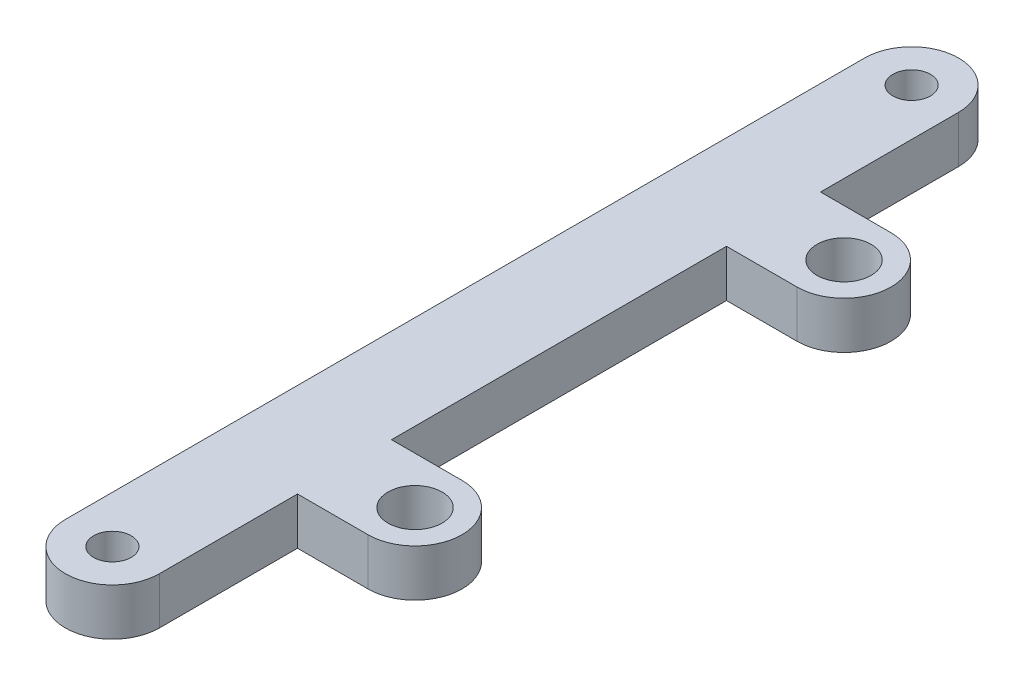
ISO-10303-21;
HEADER;
FILE_DESCRIPTION(('STEP AP214'),'2;1');
FILE_NAME('part.step','',(''),(''),'','','');
FILE_SCHEMA(('AUTOMOTIVE_DESIGN { 1 0 10303 214 1 1 1 1 }'));
ENDSEC;
DATA;
#1=APPLICATION_CONTEXT('core data for automotive mechanical design processes');
#2=APPLICATION_PROTOCOL_DEFINITION('international standard','automotive_design',2000,#1);
#3=PRODUCT_CONTEXT('',#1,'mechanical');
#4=PRODUCT('Part','Part','',(#3));
#5=PRODUCT_RELATED_PRODUCT_CATEGORY('part','',(#4));
#6=PRODUCT_DEFINITION_FORMATION('','',#4);
#7=PRODUCT_DEFINITION_CONTEXT('part definition',#1,'design');
#8=PRODUCT_DEFINITION('design','',#6,#7);
#9=PRODUCT_DEFINITION_SHAPE('','',#8);
#10=(LENGTH_UNIT() NAMED_UNIT(*) SI_UNIT(.MILLI.,.METRE.));
#11=(NAMED_UNIT(*) PLANE_ANGLE_UNIT() SI_UNIT($,.RADIAN.));
#12=(NAMED_UNIT(*) SI_UNIT($,.STERADIAN.) SOLID_ANGLE_UNIT());
#13=UNCERTAINTY_MEASURE_WITH_UNIT(LENGTH_MEASURE(1.E-05),#10,'distance_accuracy_value','');
#14=(GEOMETRIC_REPRESENTATION_CONTEXT(3) GLOBAL_UNCERTAINTY_ASSIGNED_CONTEXT((#13)) GLOBAL_UNIT_ASSIGNED_CONTEXT((#10,
#11,#12)) REPRESENTATION_CONTEXT('',''));
#15=CARTESIAN_POINT('',(0.,0.,0.));
#16=DIRECTION('',(0.,0.,1.));
#17=DIRECTION('',(1.,0.,0.));
#18=AXIS2_PLACEMENT_3D('',#15,#16,#17);
#19=CARTESIAN_POINT('',(0.,4.,-68.));
#20=DIRECTION('',(0.,1.,0.));
#21=DIRECTION('',(0.,0.,1.));
#22=AXIS2_PLACEMENT_3D('',#19,#20,#21);
#23=PLANE('',#22);
#24=CARTESIAN_POINT('',(10.,4.,-52.25));
#25=DIRECTION('',(0.,1.,0.));
#26=DIRECTION('',(0.,0.,1.));
#27=AXIS2_PLACEMENT_3D('',#24,#25,#26);
#28=CIRCLE('',#27,2.3);
#29=CARTESIAN_POINT('',(10.,4.,-49.95));
#30=VERTEX_POINT('',#29);
#31=EDGE_CURVE('E336',#30,#30,#28,.T.);
#32=ORIENTED_EDGE('',*,*,#31,.F.);
#33=EDGE_LOOP('',(#32));
#34=FACE_BOUND('',#33,.T.);
#35=CARTESIAN_POINT('',(0.,4.,-68.));
#36=DIRECTION('',(0.,1.,0.));
#37=DIRECTION('',(0.,0.,1.));
#38=AXIS2_PLACEMENT_3D('',#35,#36,#37);
#39=CIRCLE('',#38,1.6);
#40=CARTESIAN_POINT('',(0.,4.,-66.4));
#41=VERTEX_POINT('',#40);
#42=EDGE_CURVE('E174',#41,#41,#39,.T.);
#43=ORIENTED_EDGE('',*,*,#42,.F.);
#44=EDGE_LOOP('',(#43));
#45=FACE_BOUND('',#44,.T.);
#46=CARTESIAN_POINT('',(0.,4.,-68.));
#47=DIRECTION('',(0.,1.,0.));
#48=DIRECTION('',(0.,0.,1.));
#49=AXIS2_PLACEMENT_3D('',#46,#47,#48);
#50=CIRCLE('',#49,4.);
#51=CARTESIAN_POINT('',(4.,4.,-68.));
#52=VERTEX_POINT('',#51);
#53=CARTESIAN_POINT('',(-4.,4.,-68.));
#54=VERTEX_POINT('',#53);
#55=EDGE_CURVE('E204',#52,#54,#50,.T.);
#56=ORIENTED_EDGE('',*,*,#55,.T.);
#57=DIRECTION('',(0.,0.,1.));
#58=VECTOR('',#57,1.);
#59=CARTESIAN_POINT('',(-4.,4.,-68.));
#60=LINE('',#59,#58);
#61=CARTESIAN_POINT('',(-4.,4.,0.));
#62=VERTEX_POINT('',#61);
#63=EDGE_CURVE('E116',#54,#62,#60,.T.);
#64=ORIENTED_EDGE('',*,*,#63,.T.);
#65=CARTESIAN_POINT('',(0.,4.,0.));
#66=DIRECTION('',(0.,1.,0.));
#67=DIRECTION('',(0.,0.,1.));
#68=AXIS2_PLACEMENT_3D('',#65,#66,#67);
#69=CIRCLE('',#68,4.);
#70=CARTESIAN_POINT('',(4.,4.,0.));
#71=VERTEX_POINT('',#70);
#72=EDGE_CURVE('E241',#62,#71,#69,.T.);
#73=ORIENTED_EDGE('',*,*,#72,.T.);
#74=DIRECTION('',(0.,0.,-1.));
#75=VECTOR('',#74,1.);
#76=CARTESIAN_POINT('',(4.,4.,-11.75));
#77=LINE('',#76,#75);
#78=CARTESIAN_POINT('',(4.,4.,-11.75));
#79=VERTEX_POINT('',#78);
#80=EDGE_CURVE('E261',#71,#79,#77,.T.);
#81=ORIENTED_EDGE('',*,*,#80,.T.);
#82=DIRECTION('',(1.,0.,0.));
#83=VECTOR('',#82,1.);
#84=CARTESIAN_POINT('',(10.,4.,-11.75));
#85=LINE('',#84,#83);
#86=CARTESIAN_POINT('',(10.,4.,-11.75));
#87=VERTEX_POINT('',#86);
#88=EDGE_CURVE('E257',#79,#87,#85,.T.);
#89=ORIENTED_EDGE('',*,*,#88,.T.);
#90=CARTESIAN_POINT('',(10.,4.,-15.75));
#91=DIRECTION('',(0.,1.,0.));
#92=DIRECTION('',(0.,0.,-1.));
#93=AXIS2_PLACEMENT_3D('',#90,#91,#92);
#94=CIRCLE('',#93,4.);
#95=CARTESIAN_POINT('',(10.,4.,-19.75));
#96=VERTEX_POINT('',#95);
#97=EDGE_CURVE('E260',#87,#96,#94,.T.);
#98=ORIENTED_EDGE('',*,*,#97,.T.);
#99=DIRECTION('',(-1.,0.,0.));
#100=VECTOR('',#99,1.);
#101=CARTESIAN_POINT('',(10.,4.,-19.75));
#102=LINE('',#101,#100);
#103=CARTESIAN_POINT('',(4.,4.,-19.75));
#104=VERTEX_POINT('',#103);
#105=EDGE_CURVE('E265',#96,#104,#102,.T.);
#106=ORIENTED_EDGE('',*,*,#105,.T.);
#107=DIRECTION('',(0.,0.,-1.));
#108=VECTOR('',#107,1.);
#109=CARTESIAN_POINT('',(4.,4.,-48.25));
#110=LINE('',#109,#108);
#111=CARTESIAN_POINT('',(4.,4.,-48.25));
#112=VERTEX_POINT('',#111);
#113=EDGE_CURVE('E272',#104,#112,#110,.T.);
#114=ORIENTED_EDGE('',*,*,#113,.T.);
#115=DIRECTION('',(1.,0.,0.));
#116=VECTOR('',#115,1.);
#117=CARTESIAN_POINT('',(10.,4.,-48.25));
#118=LINE('',#117,#116);
#119=CARTESIAN_POINT('',(10.,4.,-48.25));
#120=VERTEX_POINT('',#119);
#121=EDGE_CURVE('E147',#112,#120,#118,.T.);
#122=ORIENTED_EDGE('',*,*,#121,.T.);
#123=CARTESIAN_POINT('',(10.,4.,-52.25));
#124=DIRECTION('',(0.,1.,0.));
#125=DIRECTION('',(0.,0.,1.));
#126=AXIS2_PLACEMENT_3D('',#123,#124,#125);
#127=CIRCLE('',#126,4.);
#128=CARTESIAN_POINT('',(10.,4.,-56.25));
#129=VERTEX_POINT('',#128);
#130=EDGE_CURVE('E141',#120,#129,#127,.T.);
#131=ORIENTED_EDGE('',*,*,#130,.T.);
#132=DIRECTION('',(-1.,0.,0.));
#133=VECTOR('',#132,1.);
#134=CARTESIAN_POINT('',(10.,4.,-56.25));
#135=LINE('',#134,#133);
#136=CARTESIAN_POINT('',(4.,4.,-56.25));
#137=VERTEX_POINT('',#136);
#138=EDGE_CURVE('E145',#129,#137,#135,.T.);
#139=ORIENTED_EDGE('',*,*,#138,.T.);
#140=DIRECTION('',(0.,0.,-1.));
#141=VECTOR('',#140,1.);
#142=CARTESIAN_POINT('',(4.,4.,-68.));
#143=LINE('',#142,#141);
#144=EDGE_CURVE('E61',#137,#52,#143,.T.);
#145=ORIENTED_EDGE('',*,*,#144,.T.);
#146=EDGE_LOOP('',(#56,#64,#73,#81,#89,#98,#106,#114,#122,#131,#139,#145));
#147=FACE_BOUND('',#146,.T.);
#148=CARTESIAN_POINT('',(0.,4.,0.));
#149=DIRECTION('',(0.,1.,0.));
#150=DIRECTION('',(0.,0.,1.));
#151=AXIS2_PLACEMENT_3D('',#148,#149,#150);
#152=CIRCLE('',#151,1.6);
#153=CARTESIAN_POINT('',(0.,4.,1.6));
#154=VERTEX_POINT('',#153);
#155=EDGE_CURVE('E344',#154,#154,#152,.T.);
#156=ORIENTED_EDGE('',*,*,#155,.F.);
#157=EDGE_LOOP('',(#156));
#158=FACE_BOUND('',#157,.T.);
#159=CARTESIAN_POINT('',(10.,4.,-15.75));
#160=DIRECTION('',(0.,1.,0.));
#161=DIRECTION('',(0.,0.,-1.));
#162=AXIS2_PLACEMENT_3D('',#159,#160,#161);
#163=CIRCLE('',#162,2.3);
#164=CARTESIAN_POINT('',(10.,4.,-18.05));
#165=VERTEX_POINT('',#164);
#166=EDGE_CURVE('E325',#165,#165,#163,.T.);
#167=ORIENTED_EDGE('',*,*,#166,.F.);
#168=EDGE_LOOP('',(#167));
#169=FACE_BOUND('',#168,.T.);
#170=ADVANCED_FACE('F43',(#34,#45,#147,#158,#169),#23,.T.);
#171=CARTESIAN_POINT('',(0.,0.,-68.));
#172=DIRECTION('',(0.,1.,0.));
#173=DIRECTION('',(0.,0.,1.));
#174=AXIS2_PLACEMENT_3D('',#171,#172,#173);
#175=PLANE('',#174);
#176=CARTESIAN_POINT('',(0.,0.,-68.));
#177=DIRECTION('',(0.,1.,0.));
#178=DIRECTION('',(0.,0.,1.));
#179=AXIS2_PLACEMENT_3D('',#176,#177,#178);
#180=CIRCLE('',#179,4.);
#181=CARTESIAN_POINT('',(4.,0.,-68.));
#182=VERTEX_POINT('',#181);
#183=CARTESIAN_POINT('',(-4.,0.,-68.));
#184=VERTEX_POINT('',#183);
#185=EDGE_CURVE('E169',#182,#184,#180,.T.);
#186=ORIENTED_EDGE('',*,*,#185,.F.);
#187=DIRECTION('',(0.,0.,-1.));
#188=VECTOR('',#187,1.);
#189=CARTESIAN_POINT('',(4.,0.,-68.));
#190=LINE('',#189,#188);
#191=CARTESIAN_POINT('',(4.,0.,-56.25));
#192=VERTEX_POINT('',#191);
#193=EDGE_CURVE('E108',#192,#182,#190,.T.);
#194=ORIENTED_EDGE('',*,*,#193,.F.);
#195=DIRECTION('',(-1.,0.,0.));
#196=VECTOR('',#195,1.);
#197=CARTESIAN_POINT('',(10.,0.,-56.25));
#198=LINE('',#197,#196);
#199=CARTESIAN_POINT('',(10.,0.,-56.25));
#200=VERTEX_POINT('',#199);
#201=EDGE_CURVE('E102',#200,#192,#198,.T.);
#202=ORIENTED_EDGE('',*,*,#201,.F.);
#203=CARTESIAN_POINT('',(10.,0.,-52.25));
#204=DIRECTION('',(0.,1.,0.));
#205=DIRECTION('',(0.,0.,1.));
#206=AXIS2_PLACEMENT_3D('',#203,#204,#205);
#207=CIRCLE('',#206,4.);
#208=CARTESIAN_POINT('',(10.,0.,-48.25));
#209=VERTEX_POINT('',#208);
#210=EDGE_CURVE('E156',#209,#200,#207,.T.);
#211=ORIENTED_EDGE('',*,*,#210,.F.);
#212=DIRECTION('',(1.,0.,0.));
#213=VECTOR('',#212,1.);
#214=CARTESIAN_POINT('',(10.,0.,-48.25));
#215=LINE('',#214,#213);
#216=CARTESIAN_POINT('',(4.,0.,-48.25));
#217=VERTEX_POINT('',#216);
#218=EDGE_CURVE('E195',#217,#209,#215,.T.);
#219=ORIENTED_EDGE('',*,*,#218,.F.);
#220=DIRECTION('',(0.,0.,-1.));
#221=VECTOR('',#220,1.);
#222=CARTESIAN_POINT('',(4.,0.,-48.25));
#223=LINE('',#222,#221);
#224=CARTESIAN_POINT('',(4.,0.,-19.75));
#225=VERTEX_POINT('',#224);
#226=EDGE_CURVE('E192',#225,#217,#223,.T.);
#227=ORIENTED_EDGE('',*,*,#226,.F.);
#228=DIRECTION('',(-1.,0.,0.));
#229=VECTOR('',#228,1.);
#230=CARTESIAN_POINT('',(10.,0.,-19.75));
#231=LINE('',#230,#229);
#232=CARTESIAN_POINT('',(10.,0.,-19.75));
#233=VERTEX_POINT('',#232);
#234=EDGE_CURVE('E189',#233,#225,#231,.T.);
#235=ORIENTED_EDGE('',*,*,#234,.F.);
#236=CARTESIAN_POINT('',(10.,0.,-15.75));
#237=DIRECTION('',(0.,1.,0.));
#238=DIRECTION('',(0.,0.,-1.));
#239=AXIS2_PLACEMENT_3D('',#236,#237,#238);
#240=CIRCLE('',#239,4.);
#241=CARTESIAN_POINT('',(10.,0.,-11.75));
#242=VERTEX_POINT('',#241);
#243=EDGE_CURVE('E186',#242,#233,#240,.T.);
#244=ORIENTED_EDGE('',*,*,#243,.F.);
#245=DIRECTION('',(1.,0.,0.));
#246=VECTOR('',#245,1.);
#247=CARTESIAN_POINT('',(10.,0.,-11.75));
#248=LINE('',#247,#246);
#249=CARTESIAN_POINT('',(4.,0.,-11.75));
#250=VERTEX_POINT('',#249);
#251=EDGE_CURVE('E183',#250,#242,#248,.T.);
#252=ORIENTED_EDGE('',*,*,#251,.F.);
#253=DIRECTION('',(0.,0.,-1.));
#254=VECTOR('',#253,1.);
#255=CARTESIAN_POINT('',(4.,0.,-11.75));
#256=LINE('',#255,#254);
#257=CARTESIAN_POINT('',(4.,0.,0.));
#258=VERTEX_POINT('',#257);
#259=EDGE_CURVE('E180',#258,#250,#256,.T.);
#260=ORIENTED_EDGE('',*,*,#259,.F.);
#261=CARTESIAN_POINT('',(0.,0.,0.));
#262=DIRECTION('',(0.,1.,0.));
#263=DIRECTION('',(0.,0.,1.));
#264=AXIS2_PLACEMENT_3D('',#261,#262,#263);
#265=CIRCLE('',#264,4.);
#266=CARTESIAN_POINT('',(-4.,0.,0.));
#267=VERTEX_POINT('',#266);
#268=EDGE_CURVE('E177',#267,#258,#265,.T.);
#269=ORIENTED_EDGE('',*,*,#268,.F.);
#270=DIRECTION('',(0.,0.,1.));
#271=VECTOR('',#270,1.);
#272=CARTESIAN_POINT('',(-4.,0.,-68.));
#273=LINE('',#272,#271);
#274=EDGE_CURVE('E173',#184,#267,#273,.T.);
#275=ORIENTED_EDGE('',*,*,#274,.F.);
#276=EDGE_LOOP('',(#186,#194,#202,#211,#219,#227,#235,#244,#252,#260,#269,#275));
#277=FACE_BOUND('',#276,.T.);
#278=CARTESIAN_POINT('',(0.,0.,-68.));
#279=DIRECTION('',(0.,1.,0.));
#280=DIRECTION('',(0.,0.,1.));
#281=AXIS2_PLACEMENT_3D('',#278,#279,#280);
#282=CIRCLE('',#281,1.6);
#283=CARTESIAN_POINT('',(0.,0.,-66.4));
#284=VERTEX_POINT('',#283);
#285=EDGE_CURVE('E348',#284,#284,#282,.T.);
#286=ORIENTED_EDGE('',*,*,#285,.T.);
#287=EDGE_LOOP('',(#286));
#288=FACE_BOUND('',#287,.T.);
#289=CARTESIAN_POINT('',(0.,0.,0.));
#290=DIRECTION('',(0.,1.,0.));
#291=DIRECTION('',(0.,0.,1.));
#292=AXIS2_PLACEMENT_3D('',#289,#290,#291);
#293=CIRCLE('',#292,1.6);
#294=CARTESIAN_POINT('',(0.,0.,1.6));
#295=VERTEX_POINT('',#294);
#296=EDGE_CURVE('E340',#295,#295,#293,.T.);
#297=ORIENTED_EDGE('',*,*,#296,.T.);
#298=EDGE_LOOP('',(#297));
#299=FACE_BOUND('',#298,.T.);
#300=CARTESIAN_POINT('',(10.,0.,-52.25));
#301=DIRECTION('',(0.,1.,0.));
#302=DIRECTION('',(0.,0.,1.));
#303=AXIS2_PLACEMENT_3D('',#300,#301,#302);
#304=CIRCLE('',#303,2.3);
#305=CARTESIAN_POINT('',(10.,0.,-49.95));
#306=VERTEX_POINT('',#305);
#307=EDGE_CURVE('E333',#306,#306,#304,.T.);
#308=ORIENTED_EDGE('',*,*,#307,.T.);
#309=EDGE_LOOP('',(#308));
#310=FACE_BOUND('',#309,.T.);
#311=CARTESIAN_POINT('',(10.,0.,-15.75));
#312=DIRECTION('',(0.,1.,0.));
#313=DIRECTION('',(0.,0.,-1.));
#314=AXIS2_PLACEMENT_3D('',#311,#312,#313);
#315=CIRCLE('',#314,2.3);
#316=CARTESIAN_POINT('',(10.,0.,-18.05));
#317=VERTEX_POINT('',#316);
#318=EDGE_CURVE('E328',#317,#317,#315,.T.);
#319=ORIENTED_EDGE('',*,*,#318,.T.);
#320=EDGE_LOOP('',(#319));
#321=FACE_BOUND('',#320,.T.);
#322=ADVANCED_FACE('F245',(#277,#288,#299,#310,#321),#175,.F.);
#323=CARTESIAN_POINT('',(0.,4.,-68.));
#324=DIRECTION('',(0.,-1.,0.));
#325=DIRECTION('',(0.,0.,-1.));
#326=AXIS2_PLACEMENT_3D('',#323,#324,#325);
#327=CYLINDRICAL_SURFACE('',#326,4.);
#328=ORIENTED_EDGE('',*,*,#185,.T.);
#329=DIRECTION('',(0.,-1.,0.));
#330=VECTOR('',#329,1.);
#331=CARTESIAN_POINT('',(-4.,4.,-68.));
#332=LINE('',#331,#330);
#333=EDGE_CURVE('E11',#54,#184,#332,.T.);
#334=ORIENTED_EDGE('',*,*,#333,.F.);
#335=ORIENTED_EDGE('',*,*,#55,.F.);
#336=DIRECTION('',(0.,-1.,0.));
#337=VECTOR('',#336,1.);
#338=CARTESIAN_POINT('',(4.,4.,-68.));
#339=LINE('',#338,#337);
#340=EDGE_CURVE('E165',#52,#182,#339,.T.);
#341=ORIENTED_EDGE('',*,*,#340,.T.);
#342=EDGE_LOOP('',(#328,#334,#335,#341));
#343=FACE_BOUND('',#342,.T.);
#344=ADVANCED_FACE('F45',(#343),#327,.T.);
#345=CARTESIAN_POINT('',(-4.,4.,-68.));
#346=DIRECTION('',(1.,0.,0.));
#347=DIRECTION('',(0.,0.,-1.));
#348=AXIS2_PLACEMENT_3D('',#345,#346,#347);
#349=PLANE('',#348);
#350=ORIENTED_EDGE('',*,*,#274,.T.);
#351=DIRECTION('',(0.,-1.,0.));
#352=VECTOR('',#351,1.);
#353=CARTESIAN_POINT('',(-4.,4.,0.));
#354=LINE('',#353,#352);
#355=EDGE_CURVE('E53',#62,#267,#354,.T.);
#356=ORIENTED_EDGE('',*,*,#355,.F.);
#357=ORIENTED_EDGE('',*,*,#63,.F.);
#358=ORIENTED_EDGE('',*,*,#333,.T.);
#359=EDGE_LOOP('',(#350,#356,#357,#358));
#360=FACE_BOUND('',#359,.T.);
#361=ADVANCED_FACE('F474',(#360),#349,.F.);
#362=CARTESIAN_POINT('',(0.,4.,0.));
#363=DIRECTION('',(0.,-1.,0.));
#364=DIRECTION('',(0.,0.,-1.));
#365=AXIS2_PLACEMENT_3D('',#362,#363,#364);
#366=CYLINDRICAL_SURFACE('',#365,4.);
#367=ORIENTED_EDGE('',*,*,#268,.T.);
#368=DIRECTION('',(0.,-1.,0.));
#369=VECTOR('',#368,1.);
#370=CARTESIAN_POINT('',(4.,4.,0.));
#371=LINE('',#370,#369);
#372=EDGE_CURVE('E231',#71,#258,#371,.T.);
#373=ORIENTED_EDGE('',*,*,#372,.F.);
#374=ORIENTED_EDGE('',*,*,#72,.F.);
#375=ORIENTED_EDGE('',*,*,#355,.T.);
#376=EDGE_LOOP('',(#367,#373,#374,#375));
#377=FACE_BOUND('',#376,.T.);
#378=ADVANCED_FACE('F239',(#377),#366,.T.);
#379=CARTESIAN_POINT('',(4.,4.,-11.75));
#380=DIRECTION('',(-1.,0.,0.));
#381=DIRECTION('',(0.,0.,1.));
#382=AXIS2_PLACEMENT_3D('',#379,#380,#381);
#383=PLANE('',#382);
#384=ORIENTED_EDGE('',*,*,#259,.T.);
#385=DIRECTION('',(0.,-1.,0.));
#386=VECTOR('',#385,1.);
#387=CARTESIAN_POINT('',(4.,4.,-11.75));
#388=LINE('',#387,#386);
#389=EDGE_CURVE('E227',#79,#250,#388,.T.);
#390=ORIENTED_EDGE('',*,*,#389,.F.);
#391=ORIENTED_EDGE('',*,*,#80,.F.);
#392=ORIENTED_EDGE('',*,*,#372,.T.);
#393=EDGE_LOOP('',(#384,#390,#391,#392));
#394=FACE_BOUND('',#393,.T.);
#395=ADVANCED_FACE('F251',(#394),#383,.F.);
#396=CARTESIAN_POINT('',(10.,4.,-11.75));
#397=DIRECTION('',(0.,0.,-1.));
#398=DIRECTION('',(-1.,0.,0.));
#399=AXIS2_PLACEMENT_3D('',#396,#397,#398);
#400=PLANE('',#399);
#401=ORIENTED_EDGE('',*,*,#251,.T.);
#402=DIRECTION('',(0.,-1.,0.));
#403=VECTOR('',#402,1.);
#404=CARTESIAN_POINT('',(10.,4.,-11.75));
#405=LINE('',#404,#403);
#406=EDGE_CURVE('E223',#87,#242,#405,.T.);
#407=ORIENTED_EDGE('',*,*,#406,.F.);
#408=ORIENTED_EDGE('',*,*,#88,.F.);
#409=ORIENTED_EDGE('',*,*,#389,.T.);
#410=EDGE_LOOP('',(#401,#407,#408,#409));
#411=FACE_BOUND('',#410,.T.);
#412=ADVANCED_FACE('F255',(#411),#400,.F.);
#413=CARTESIAN_POINT('',(10.,4.,-15.75));
#414=DIRECTION('',(0.,-1.,0.));
#415=DIRECTION('',(0.,0.,-1.));
#416=AXIS2_PLACEMENT_3D('',#413,#414,#415);
#417=CYLINDRICAL_SURFACE('',#416,4.);
#418=ORIENTED_EDGE('',*,*,#243,.T.);
#419=DIRECTION('',(0.,-1.,0.));
#420=VECTOR('',#419,1.);
#421=CARTESIAN_POINT('',(10.,4.,-19.75));
#422=LINE('',#421,#420);
#423=EDGE_CURVE('E219',#96,#233,#422,.T.);
#424=ORIENTED_EDGE('',*,*,#423,.F.);
#425=ORIENTED_EDGE('',*,*,#97,.F.);
#426=ORIENTED_EDGE('',*,*,#406,.T.);
#427=EDGE_LOOP('',(#418,#424,#425,#426));
#428=FACE_BOUND('',#427,.T.);
#429=ADVANCED_FACE('F435',(#428),#417,.T.);
#430=CARTESIAN_POINT('',(10.,4.,-19.75));
#431=DIRECTION('',(0.,0.,1.));
#432=DIRECTION('',(1.,0.,0.));
#433=AXIS2_PLACEMENT_3D('',#430,#431,#432);
#434=PLANE('',#433);
#435=ORIENTED_EDGE('',*,*,#234,.T.);
#436=DIRECTION('',(0.,-1.,0.));
#437=VECTOR('',#436,1.);
#438=CARTESIAN_POINT('',(4.,4.,-19.75));
#439=LINE('',#438,#437);
#440=EDGE_CURVE('E215',#104,#225,#439,.T.);
#441=ORIENTED_EDGE('',*,*,#440,.F.);
#442=ORIENTED_EDGE('',*,*,#105,.F.);
#443=ORIENTED_EDGE('',*,*,#423,.T.);
#444=EDGE_LOOP('',(#435,#441,#442,#443));
#445=FACE_BOUND('',#444,.T.);
#446=ADVANCED_FACE('F425',(#445),#434,.F.);
#447=CARTESIAN_POINT('',(4.,4.,-48.25));
#448=DIRECTION('',(-1.,0.,0.));
#449=DIRECTION('',(0.,0.,1.));
#450=AXIS2_PLACEMENT_3D('',#447,#448,#449);
#451=PLANE('',#450);
#452=ORIENTED_EDGE('',*,*,#226,.T.);
#453=DIRECTION('',(0.,-1.,0.));
#454=VECTOR('',#453,1.);
#455=CARTESIAN_POINT('',(4.,4.,-48.25));
#456=LINE('',#455,#454);
#457=EDGE_CURVE('E211',#112,#217,#456,.T.);
#458=ORIENTED_EDGE('',*,*,#457,.F.);
#459=ORIENTED_EDGE('',*,*,#113,.F.);
#460=ORIENTED_EDGE('',*,*,#440,.T.);
#461=EDGE_LOOP('',(#452,#458,#459,#460));
#462=FACE_BOUND('',#461,.T.);
#463=ADVANCED_FACE('F280',(#462),#451,.F.);
#464=CARTESIAN_POINT('',(10.,4.,-48.25));
#465=DIRECTION('',(0.,0.,-1.));
#466=DIRECTION('',(-1.,0.,0.));
#467=AXIS2_PLACEMENT_3D('',#464,#465,#466);
#468=PLANE('',#467);
#469=ORIENTED_EDGE('',*,*,#218,.T.);
#470=DIRECTION('',(0.,-1.,0.));
#471=VECTOR('',#470,1.);
#472=CARTESIAN_POINT('',(10.,4.,-48.25));
#473=LINE('',#472,#471);
#474=EDGE_CURVE('E158',#120,#209,#473,.T.);
#475=ORIENTED_EDGE('',*,*,#474,.F.);
#476=ORIENTED_EDGE('',*,*,#121,.F.);
#477=ORIENTED_EDGE('',*,*,#457,.T.);
#478=EDGE_LOOP('',(#469,#475,#476,#477));
#479=FACE_BOUND('',#478,.T.);
#480=ADVANCED_FACE('F284',(#479),#468,.F.);
#481=CARTESIAN_POINT('',(10.,4.,-52.25));
#482=DIRECTION('',(0.,-1.,0.));
#483=DIRECTION('',(0.,0.,-1.));
#484=AXIS2_PLACEMENT_3D('',#481,#482,#483);
#485=CYLINDRICAL_SURFACE('',#484,4.);
#486=ORIENTED_EDGE('',*,*,#210,.T.);
#487=DIRECTION('',(0.,-1.,0.));
#488=VECTOR('',#487,1.);
#489=CARTESIAN_POINT('',(10.,4.,-56.25));
#490=LINE('',#489,#488);
#491=EDGE_CURVE('E153',#129,#200,#490,.T.);
#492=ORIENTED_EDGE('',*,*,#491,.F.);
#493=ORIENTED_EDGE('',*,*,#130,.F.);
#494=ORIENTED_EDGE('',*,*,#474,.T.);
#495=EDGE_LOOP('',(#486,#492,#493,#494));
#496=FACE_BOUND('',#495,.T.);
#497=ADVANCED_FACE('F154',(#496),#485,.T.);
#498=CARTESIAN_POINT('',(10.,4.,-56.25));
#499=DIRECTION('',(0.,0.,1.));
#500=DIRECTION('',(1.,0.,0.));
#501=AXIS2_PLACEMENT_3D('',#498,#499,#500);
#502=PLANE('',#501);
#503=ORIENTED_EDGE('',*,*,#201,.T.);
#504=DIRECTION('',(0.,-1.,0.));
#505=VECTOR('',#504,1.);
#506=CARTESIAN_POINT('',(4.,4.,-56.25));
#507=LINE('',#506,#505);
#508=EDGE_CURVE('E159',#137,#192,#507,.T.);
#509=ORIENTED_EDGE('',*,*,#508,.F.);
#510=ORIENTED_EDGE('',*,*,#138,.F.);
#511=ORIENTED_EDGE('',*,*,#491,.T.);
#512=EDGE_LOOP('',(#503,#509,#510,#511));
#513=FACE_BOUND('',#512,.T.);
#514=ADVANCED_FACE('F161',(#513),#502,.F.);
#515=CARTESIAN_POINT('',(4.,4.,-68.));
#516=DIRECTION('',(-1.,0.,0.));
#517=DIRECTION('',(0.,0.,1.));
#518=AXIS2_PLACEMENT_3D('',#515,#516,#517);
#519=PLANE('',#518);
#520=ORIENTED_EDGE('',*,*,#193,.T.);
#521=ORIENTED_EDGE('',*,*,#340,.F.);
#522=ORIENTED_EDGE('',*,*,#144,.F.);
#523=ORIENTED_EDGE('',*,*,#508,.T.);
#524=EDGE_LOOP('',(#520,#521,#522,#523));
#525=FACE_BOUND('',#524,.T.);
#526=ADVANCED_FACE('F288',(#525),#519,.F.);
#527=CARTESIAN_POINT('',(0.,4.,-68.));
#528=DIRECTION('',(0.,-1.,0.));
#529=DIRECTION('',(0.,0.,-1.));
#530=AXIS2_PLACEMENT_3D('',#527,#528,#529);
#531=CYLINDRICAL_SURFACE('',#530,1.6);
#532=ORIENTED_EDGE('',*,*,#42,.T.);
#533=EDGE_LOOP('',(#532));
#534=FACE_BOUND('',#533,.T.);
#535=ORIENTED_EDGE('',*,*,#285,.F.);
#536=EDGE_LOOP('',(#535));
#537=FACE_BOUND('',#536,.T.);
#538=ADVANCED_FACE('F290',(#534,#537),#531,.F.);
#539=CARTESIAN_POINT('',(0.,4.,0.));
#540=DIRECTION('',(0.,-1.,0.));
#541=DIRECTION('',(0.,0.,-1.));
#542=AXIS2_PLACEMENT_3D('',#539,#540,#541);
#543=CYLINDRICAL_SURFACE('',#542,1.6);
#544=ORIENTED_EDGE('',*,*,#155,.T.);
#545=EDGE_LOOP('',(#544));
#546=FACE_BOUND('',#545,.T.);
#547=ORIENTED_EDGE('',*,*,#296,.F.);
#548=EDGE_LOOP('',(#547));
#549=FACE_BOUND('',#548,.T.);
#550=ADVANCED_FACE('F296',(#546,#549),#543,.F.);
#551=CARTESIAN_POINT('',(10.,4.,-52.25));
#552=DIRECTION('',(0.,-1.,0.));
#553=DIRECTION('',(0.,0.,-1.));
#554=AXIS2_PLACEMENT_3D('',#551,#552,#553);
#555=CYLINDRICAL_SURFACE('',#554,2.3);
#556=ORIENTED_EDGE('',*,*,#31,.T.);
#557=EDGE_LOOP('',(#556));
#558=FACE_BOUND('',#557,.T.);
#559=ORIENTED_EDGE('',*,*,#307,.F.);
#560=EDGE_LOOP('',(#559));
#561=FACE_BOUND('',#560,.T.);
#562=ADVANCED_FACE('F312',(#558,#561),#555,.F.);
#563=CARTESIAN_POINT('',(10.,4.,-15.75));
#564=DIRECTION('',(0.,-1.,0.));
#565=DIRECTION('',(0.,0.,-1.));
#566=AXIS2_PLACEMENT_3D('',#563,#564,#565);
#567=CYLINDRICAL_SURFACE('',#566,2.3);
#568=ORIENTED_EDGE('',*,*,#166,.T.);
#569=EDGE_LOOP('',(#568));
#570=FACE_BOUND('',#569,.T.);
#571=ORIENTED_EDGE('',*,*,#318,.F.);
#572=EDGE_LOOP('',(#571));
#573=FACE_BOUND('',#572,.T.);
#574=ADVANCED_FACE('F316',(#570,#573),#567,.F.);
#575=CLOSED_SHELL('',(#170,#322,#344,#361,#378,#395,#412,#429,#446,#463,#480,#497,#514,#526,
#538,#550,#562,#574));
#576=MANIFOLD_SOLID_BREP('B2',#575);
#577=ADVANCED_BREP_SHAPE_REPRESENTATION('',(#18,#576),#14);
#578=SHAPE_DEFINITION_REPRESENTATION(#9,#577);
ENDSEC;
END-ISO-10303-21;
